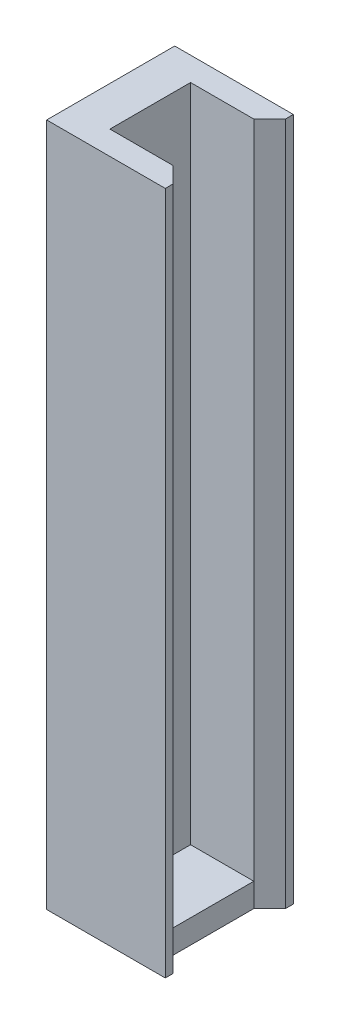
ISO-10303-21;
HEADER;
FILE_DESCRIPTION(('STEP AP214'),'2;1');
FILE_NAME('part.step','',(''),(''),'','','');
FILE_SCHEMA(('AUTOMOTIVE_DESIGN { 1 0 10303 214 1 1 1 1 }'));
ENDSEC;
DATA;
#1=APPLICATION_CONTEXT('core data for automotive mechanical design processes');
#2=APPLICATION_PROTOCOL_DEFINITION('international standard','automotive_design',2000,#1);
#3=PRODUCT_CONTEXT('',#1,'mechanical');
#4=PRODUCT('Part','Part','',(#3));
#5=PRODUCT_RELATED_PRODUCT_CATEGORY('part','',(#4));
#6=PRODUCT_DEFINITION_FORMATION('','',#4);
#7=PRODUCT_DEFINITION_CONTEXT('part definition',#1,'design');
#8=PRODUCT_DEFINITION('design','',#6,#7);
#9=PRODUCT_DEFINITION_SHAPE('','',#8);
#10=(LENGTH_UNIT() NAMED_UNIT(*) SI_UNIT(.MILLI.,.METRE.));
#11=(NAMED_UNIT(*) PLANE_ANGLE_UNIT() SI_UNIT($,.RADIAN.));
#12=(NAMED_UNIT(*) SI_UNIT($,.STERADIAN.) SOLID_ANGLE_UNIT());
#13=UNCERTAINTY_MEASURE_WITH_UNIT(LENGTH_MEASURE(1.E-05),#10,'distance_accuracy_value','');
#14=(GEOMETRIC_REPRESENTATION_CONTEXT(3) GLOBAL_UNCERTAINTY_ASSIGNED_CONTEXT((#13)) GLOBAL_UNIT_ASSIGNED_CONTEXT((#10,
#11,#12)) REPRESENTATION_CONTEXT('',''));
#15=CARTESIAN_POINT('',(0.,0.,0.));
#16=DIRECTION('',(0.,0.,1.));
#17=DIRECTION('',(1.,0.,0.));
#18=AXIS2_PLACEMENT_3D('',#15,#16,#17);
#19=CARTESIAN_POINT('',(-12.5,-26.5,0.));
#20=DIRECTION('',(0.,1.,0.));
#21=DIRECTION('',(0.,0.,1.));
#22=AXIS2_PLACEMENT_3D('',#19,#20,#21);
#23=PLANE('',#22);
#24=DIRECTION('',(0.,0.,-1.));
#25=VECTOR('',#24,1.);
#26=CARTESIAN_POINT('',(2.5,-26.5,8.1));
#27=LINE('',#26,#25);
#28=CARTESIAN_POINT('',(2.5,-26.5,8.1));
#29=VERTEX_POINT('',#28);
#30=CARTESIAN_POINT('',(2.5,-26.5,7.1));
#31=VERTEX_POINT('',#30);
#32=EDGE_CURVE('E172',#29,#31,#27,.T.);
#33=ORIENTED_EDGE('',*,*,#32,.T.);
#34=DIRECTION('',(0.707106781186546,0.,0.707106781186549));
#35=VECTOR('',#34,1.);
#36=CARTESIAN_POINT('',(-8.54999999999998,-26.5,-3.95000000000001));
#37=LINE('',#36,#35);
#38=CARTESIAN_POINT('',(0.500000000000002,-26.5,5.1));
#39=VERTEX_POINT('',#38);
#40=EDGE_CURVE('E12',#31,#39,#37,.F.);
#41=ORIENTED_EDGE('',*,*,#40,.T.);
#42=DIRECTION('',(1.,0.,0.));
#43=VECTOR('',#42,1.);
#44=CARTESIAN_POINT('',(-12.5,-26.5,5.1));
#45=LINE('',#44,#43);
#46=CARTESIAN_POINT('',(-7.5,-26.5,5.1));
#47=VERTEX_POINT('',#46);
#48=EDGE_CURVE('E135',#47,#39,#45,.T.);
#49=ORIENTED_EDGE('',*,*,#48,.F.);
#50=DIRECTION('',(0.,0.,1.));
#51=VECTOR('',#50,1.);
#52=CARTESIAN_POINT('',(-7.5,-26.5,0.));
#53=LINE('',#52,#51);
#54=CARTESIAN_POINT('',(-7.5,-26.5,-5.1));
#55=VERTEX_POINT('',#54);
#56=EDGE_CURVE('E197',#55,#47,#53,.T.);
#57=ORIENTED_EDGE('',*,*,#56,.F.);
#58=DIRECTION('',(1.,0.,0.));
#59=VECTOR('',#58,1.);
#60=CARTESIAN_POINT('',(-12.5,-26.5,-5.1));
#61=LINE('',#60,#59);
#62=CARTESIAN_POINT('',(0.499999999999995,-26.5,-5.1));
#63=VERTEX_POINT('',#62);
#64=EDGE_CURVE('E182',#55,#63,#61,.T.);
#65=ORIENTED_EDGE('',*,*,#64,.T.);
#66=DIRECTION('',(0.707106781186549,0.,-0.707106781186546));
#67=VECTOR('',#66,1.);
#68=CARTESIAN_POINT('',(-8.55000000000003,-26.5,3.94999999999999));
#69=LINE('',#68,#67);
#70=CARTESIAN_POINT('',(2.5,-26.5,-7.09999999999999));
#71=VERTEX_POINT('',#70);
#72=EDGE_CURVE('E48',#63,#71,#69,.T.);
#73=ORIENTED_EDGE('',*,*,#72,.T.);
#74=DIRECTION('',(0.,0.,1.));
#75=VECTOR('',#74,1.);
#76=CARTESIAN_POINT('',(2.5,-26.5,-8.1));
#77=LINE('',#76,#75);
#78=CARTESIAN_POINT('',(2.5,-26.5,-8.1));
#79=VERTEX_POINT('',#78);
#80=EDGE_CURVE('E188',#79,#71,#77,.T.);
#81=ORIENTED_EDGE('',*,*,#80,.F.);
#82=DIRECTION('',(1.,0.,0.));
#83=VECTOR('',#82,1.);
#84=CARTESIAN_POINT('',(-12.5,-26.5,-8.1));
#85=LINE('',#84,#83);
#86=CARTESIAN_POINT('',(-12.5,-26.5,-8.1));
#87=VERTEX_POINT('',#86);
#88=EDGE_CURVE('E185',#87,#79,#85,.T.);
#89=ORIENTED_EDGE('',*,*,#88,.F.);
#90=DIRECTION('',(0.,0.,1.));
#91=VECTOR('',#90,1.);
#92=CARTESIAN_POINT('',(-12.5,-26.5,0.));
#93=LINE('',#92,#91);
#94=CARTESIAN_POINT('',(-12.5,-26.5,8.1));
#95=VERTEX_POINT('',#94);
#96=EDGE_CURVE('E200',#87,#95,#93,.T.);
#97=ORIENTED_EDGE('',*,*,#96,.T.);
#98=DIRECTION('',(1.,0.,0.));
#99=VECTOR('',#98,1.);
#100=CARTESIAN_POINT('',(-12.5,-26.5,8.1));
#101=LINE('',#100,#99);
#102=EDGE_CURVE('E169',#95,#29,#101,.T.);
#103=ORIENTED_EDGE('',*,*,#102,.T.);
#104=EDGE_LOOP('',(#33,#41,#49,#57,#65,#73,#81,#89,#97,#103));
#105=FACE_BOUND('',#104,.T.);
#106=ADVANCED_FACE('F39',(#105),#23,.T.);
#107=CARTESIAN_POINT('',(-12.5,-74.,0.));
#108=DIRECTION('',(1.,0.,0.));
#109=DIRECTION('',(0.,0.,-1.));
#110=AXIS2_PLACEMENT_3D('',#107,#108,#109);
#111=CYLINDRICAL_SURFACE('',#110,1.6);
#112=CARTESIAN_POINT('',(-12.5,-74.,0.));
#113=DIRECTION('',(-1.,0.,0.));
#114=DIRECTION('',(0.,0.,1.));
#115=AXIS2_PLACEMENT_3D('',#112,#113,#114);
#116=CIRCLE('',#115,1.6);
#117=CARTESIAN_POINT('',(-12.5,-74.,1.60000000000008));
#118=VERTEX_POINT('',#117);
#119=EDGE_CURVE('E203',#118,#118,#116,.F.);
#120=ORIENTED_EDGE('',*,*,#119,.F.);
#121=EDGE_LOOP('',(#120));
#122=FACE_BOUND('',#121,.T.);
#123=CARTESIAN_POINT('',(-7.5,-74.,0.));
#124=DIRECTION('',(-1.,0.,0.));
#125=DIRECTION('',(0.,0.,1.));
#126=AXIS2_PLACEMENT_3D('',#123,#124,#125);
#127=CIRCLE('',#126,1.6);
#128=CARTESIAN_POINT('',(-7.5,-74.,1.60000000000008));
#129=VERTEX_POINT('',#128);
#130=EDGE_CURVE('E218',#129,#129,#127,.F.);
#131=ORIENTED_EDGE('',*,*,#130,.T.);
#132=EDGE_LOOP('',(#131));
#133=FACE_BOUND('',#132,.T.);
#134=ADVANCED_FACE('F265',(#122,#133),#111,.F.);
#135=CARTESIAN_POINT('',(-12.5,-34.,0.));
#136=DIRECTION('',(1.,0.,0.));
#137=DIRECTION('',(0.,0.,-1.));
#138=AXIS2_PLACEMENT_3D('',#135,#136,#137);
#139=CYLINDRICAL_SURFACE('',#138,1.6);
#140=CARTESIAN_POINT('',(-12.5,-34.,0.));
#141=DIRECTION('',(-1.,0.,0.));
#142=DIRECTION('',(0.,0.,1.));
#143=AXIS2_PLACEMENT_3D('',#140,#141,#142);
#144=CIRCLE('',#143,1.6);
#145=CARTESIAN_POINT('',(-12.5,-34.,1.60000000000005));
#146=VERTEX_POINT('',#145);
#147=EDGE_CURVE('E207',#146,#146,#144,.F.);
#148=ORIENTED_EDGE('',*,*,#147,.F.);
#149=EDGE_LOOP('',(#148));
#150=FACE_BOUND('',#149,.T.);
#151=CARTESIAN_POINT('',(-7.5,-34.,0.));
#152=DIRECTION('',(-1.,0.,0.));
#153=DIRECTION('',(0.,0.,1.));
#154=AXIS2_PLACEMENT_3D('',#151,#152,#153);
#155=CIRCLE('',#154,1.6);
#156=CARTESIAN_POINT('',(-7.5,-34.,1.60000000000005));
#157=VERTEX_POINT('',#156);
#158=EDGE_CURVE('E204',#157,#157,#155,.F.);
#159=ORIENTED_EDGE('',*,*,#158,.T.);
#160=EDGE_LOOP('',(#159));
#161=FACE_BOUND('',#160,.T.);
#162=ADVANCED_FACE('F270',(#150,#161),#139,.F.);
#163=CARTESIAN_POINT('',(-12.5,0.,0.));
#164=DIRECTION('',(-1.,0.,0.));
#165=DIRECTION('',(0.,0.,1.));
#166=AXIS2_PLACEMENT_3D('',#163,#164,#165);
#167=PLANE('',#166);
#168=ORIENTED_EDGE('',*,*,#96,.F.);
#169=DIRECTION('',(0.,1.,0.));
#170=VECTOR('',#169,1.);
#171=CARTESIAN_POINT('',(-12.5,-110.,-8.1));
#172=LINE('',#171,#170);
#173=CARTESIAN_POINT('',(-12.5,-113.,-8.1));
#174=VERTEX_POINT('',#173);
#175=EDGE_CURVE('E193',#174,#87,#172,.T.);
#176=ORIENTED_EDGE('',*,*,#175,.F.);
#177=DIRECTION('',(0.,0.,-1.));
#178=VECTOR('',#177,1.);
#179=CARTESIAN_POINT('',(-12.5,-113.,0.));
#180=LINE('',#179,#178);
#181=CARTESIAN_POINT('',(-12.5,-113.,8.1));
#182=VERTEX_POINT('',#181);
#183=EDGE_CURVE('E159',#182,#174,#180,.T.);
#184=ORIENTED_EDGE('',*,*,#183,.F.);
#185=DIRECTION('',(0.,1.,0.));
#186=VECTOR('',#185,1.);
#187=CARTESIAN_POINT('',(-12.5,-110.,8.1));
#188=LINE('',#187,#186);
#189=EDGE_CURVE('E178',#182,#95,#188,.T.);
#190=ORIENTED_EDGE('',*,*,#189,.T.);
#191=EDGE_LOOP('',(#168,#176,#184,#190));
#192=FACE_BOUND('',#191,.T.);
#193=ORIENTED_EDGE('',*,*,#119,.T.);
#194=EDGE_LOOP('',(#193));
#195=FACE_BOUND('',#194,.T.);
#196=ORIENTED_EDGE('',*,*,#147,.T.);
#197=EDGE_LOOP('',(#196));
#198=FACE_BOUND('',#197,.T.);
#199=ADVANCED_FACE('F281',(#192,#195,#198),#167,.T.);
#200=CARTESIAN_POINT('',(-7.5,0.,0.));
#201=DIRECTION('',(-1.,0.,0.));
#202=DIRECTION('',(0.,0.,1.));
#203=AXIS2_PLACEMENT_3D('',#200,#201,#202);
#204=PLANE('',#203);
#205=ORIENTED_EDGE('',*,*,#56,.T.);
#206=DIRECTION('',(0.,1.,0.));
#207=VECTOR('',#206,1.);
#208=CARTESIAN_POINT('',(-7.5,0.,5.1));
#209=LINE('',#208,#207);
#210=CARTESIAN_POINT('',(-7.5,-110.,5.1));
#211=VERTEX_POINT('',#210);
#212=EDGE_CURVE('E217',#211,#47,#209,.T.);
#213=ORIENTED_EDGE('',*,*,#212,.F.);
#214=DIRECTION('',(0.,0.,1.));
#215=VECTOR('',#214,1.);
#216=CARTESIAN_POINT('',(-7.5,-110.,0.));
#217=LINE('',#216,#215);
#218=CARTESIAN_POINT('',(-7.5,-110.,-5.1));
#219=VERTEX_POINT('',#218);
#220=EDGE_CURVE('E214',#219,#211,#217,.T.);
#221=ORIENTED_EDGE('',*,*,#220,.F.);
#222=DIRECTION('',(0.,-1.,0.));
#223=VECTOR('',#222,1.);
#224=CARTESIAN_POINT('',(-7.5,0.,-5.1));
#225=LINE('',#224,#223);
#226=EDGE_CURVE('E213',#55,#219,#225,.T.);
#227=ORIENTED_EDGE('',*,*,#226,.F.);
#228=EDGE_LOOP('',(#205,#213,#221,#227));
#229=FACE_BOUND('',#228,.T.);
#230=ORIENTED_EDGE('',*,*,#130,.F.);
#231=EDGE_LOOP('',(#230));
#232=FACE_BOUND('',#231,.T.);
#233=ORIENTED_EDGE('',*,*,#158,.F.);
#234=EDGE_LOOP('',(#233));
#235=FACE_BOUND('',#234,.T.);
#236=ADVANCED_FACE('F255',(#229,#232,#235),#204,.F.);
#237=CARTESIAN_POINT('',(0.,0.,-5.1));
#238=DIRECTION('',(0.,0.,-1.));
#239=DIRECTION('',(-1.,0.,0.));
#240=AXIS2_PLACEMENT_3D('',#237,#238,#239);
#241=PLANE('',#240);
#242=DIRECTION('',(-1.,0.,0.));
#243=VECTOR('',#242,1.);
#244=CARTESIAN_POINT('',(-12.5,-110.,-5.1));
#245=LINE('',#244,#243);
#246=CARTESIAN_POINT('',(0.499999999999995,-110.,-5.1));
#247=VERTEX_POINT('',#246);
#248=EDGE_CURVE('E192',#247,#219,#245,.T.);
#249=ORIENTED_EDGE('',*,*,#248,.F.);
#250=DIRECTION('',(0.,1.,0.));
#251=VECTOR('',#250,1.);
#252=CARTESIAN_POINT('',(0.499999999999996,0.,-5.1));
#253=LINE('',#252,#251);
#254=EDGE_CURVE('E63',#247,#63,#253,.T.);
#255=ORIENTED_EDGE('',*,*,#254,.T.);
#256=ORIENTED_EDGE('',*,*,#64,.F.);
#257=ORIENTED_EDGE('',*,*,#226,.T.);
#258=EDGE_LOOP('',(#249,#255,#256,#257));
#259=FACE_BOUND('',#258,.T.);
#260=ADVANCED_FACE('F257',(#259),#241,.F.);
#261=CARTESIAN_POINT('',(2.5,-110.,-8.1));
#262=DIRECTION('',(-1.,0.,0.));
#263=DIRECTION('',(0.,0.,1.));
#264=AXIS2_PLACEMENT_3D('',#261,#262,#263);
#265=PLANE('',#264);
#266=DIRECTION('',(0.,-1.,0.));
#267=VECTOR('',#266,1.);
#268=CARTESIAN_POINT('',(2.5,-110.,-8.1));
#269=LINE('',#268,#267);
#270=CARTESIAN_POINT('',(2.5,-113.,-8.1));
#271=VERTEX_POINT('',#270);
#272=EDGE_CURVE('E195',#79,#271,#269,.T.);
#273=ORIENTED_EDGE('',*,*,#272,.F.);
#274=ORIENTED_EDGE('',*,*,#80,.T.);
#275=DIRECTION('',(0.,-1.,0.));
#276=VECTOR('',#275,1.);
#277=CARTESIAN_POINT('',(2.5,-110.,-7.09999999999999));
#278=LINE('',#277,#276);
#279=CARTESIAN_POINT('',(2.5,-113.,-7.09999999999999));
#280=VERTEX_POINT('',#279);
#281=EDGE_CURVE('E55',#71,#280,#278,.T.);
#282=ORIENTED_EDGE('',*,*,#281,.T.);
#283=DIRECTION('',(0.,0.,1.));
#284=VECTOR('',#283,1.);
#285=CARTESIAN_POINT('',(2.5,-113.,0.));
#286=LINE('',#285,#284);
#287=EDGE_CURVE('E165',#271,#280,#286,.T.);
#288=ORIENTED_EDGE('',*,*,#287,.F.);
#289=EDGE_LOOP('',(#273,#274,#282,#288));
#290=FACE_BOUND('',#289,.T.);
#291=ADVANCED_FACE('F233',(#290),#265,.F.);
#292=CARTESIAN_POINT('',(0.,0.,-8.1));
#293=DIRECTION('',(0.,0.,-1.));
#294=DIRECTION('',(-1.,0.,0.));
#295=AXIS2_PLACEMENT_3D('',#292,#293,#294);
#296=PLANE('',#295);
#297=ORIENTED_EDGE('',*,*,#175,.T.);
#298=ORIENTED_EDGE('',*,*,#88,.T.);
#299=ORIENTED_EDGE('',*,*,#272,.T.);
#300=DIRECTION('',(1.,0.,0.));
#301=VECTOR('',#300,1.);
#302=CARTESIAN_POINT('',(0.,-113.,-8.1));
#303=LINE('',#302,#301);
#304=EDGE_CURVE('E162',#174,#271,#303,.T.);
#305=ORIENTED_EDGE('',*,*,#304,.F.);
#306=EDGE_LOOP('',(#297,#298,#299,#305));
#307=FACE_BOUND('',#306,.T.);
#308=ADVANCED_FACE('F237',(#307),#296,.T.);
#309=CARTESIAN_POINT('',(0.,0.,5.1));
#310=DIRECTION('',(0.,0.,1.));
#311=DIRECTION('',(-1.,0.,0.));
#312=AXIS2_PLACEMENT_3D('',#309,#310,#311);
#313=PLANE('',#312);
#314=ORIENTED_EDGE('',*,*,#212,.T.);
#315=ORIENTED_EDGE('',*,*,#48,.T.);
#316=DIRECTION('',(0.,-1.,0.));
#317=VECTOR('',#316,1.);
#318=CARTESIAN_POINT('',(0.500000000000003,-110.,5.1));
#319=LINE('',#318,#317);
#320=CARTESIAN_POINT('',(0.500000000000002,-110.,5.1));
#321=VERTEX_POINT('',#320);
#322=EDGE_CURVE('E210',#39,#321,#319,.T.);
#323=ORIENTED_EDGE('',*,*,#322,.T.);
#324=DIRECTION('',(-1.,0.,0.));
#325=VECTOR('',#324,1.);
#326=CARTESIAN_POINT('',(-12.5,-110.,5.1));
#327=LINE('',#326,#325);
#328=EDGE_CURVE('E177',#321,#211,#327,.T.);
#329=ORIENTED_EDGE('',*,*,#328,.T.);
#330=EDGE_LOOP('',(#314,#315,#323,#329));
#331=FACE_BOUND('',#330,.T.);
#332=ADVANCED_FACE('F250',(#331),#313,.F.);
#333=CARTESIAN_POINT('',(2.5,-110.,8.1));
#334=DIRECTION('',(1.,0.,0.));
#335=DIRECTION('',(0.,0.,-1.));
#336=AXIS2_PLACEMENT_3D('',#333,#334,#335);
#337=PLANE('',#336);
#338=DIRECTION('',(0.,-1.,0.));
#339=VECTOR('',#338,1.);
#340=CARTESIAN_POINT('',(2.5,-110.,8.1));
#341=LINE('',#340,#339);
#342=CARTESIAN_POINT('',(2.5,-113.,8.1));
#343=VERTEX_POINT('',#342);
#344=EDGE_CURVE('E180',#29,#343,#341,.T.);
#345=ORIENTED_EDGE('',*,*,#344,.T.);
#346=DIRECTION('',(0.,0.,1.));
#347=VECTOR('',#346,1.);
#348=CARTESIAN_POINT('',(2.5,-113.,0.));
#349=LINE('',#348,#347);
#350=CARTESIAN_POINT('',(2.5,-113.,7.1));
#351=VERTEX_POINT('',#350);
#352=EDGE_CURVE('E146',#351,#343,#349,.T.);
#353=ORIENTED_EDGE('',*,*,#352,.F.);
#354=DIRECTION('',(0.,1.,0.));
#355=VECTOR('',#354,1.);
#356=CARTESIAN_POINT('',(2.5,-105.,7.1));
#357=LINE('',#356,#355);
#358=EDGE_CURVE('E142',#351,#31,#357,.T.);
#359=ORIENTED_EDGE('',*,*,#358,.T.);
#360=ORIENTED_EDGE('',*,*,#32,.F.);
#361=EDGE_LOOP('',(#345,#353,#359,#360));
#362=FACE_BOUND('',#361,.T.);
#363=ADVANCED_FACE('F246',(#362),#337,.T.);
#364=CARTESIAN_POINT('',(0.,0.,8.1));
#365=DIRECTION('',(0.,0.,1.));
#366=DIRECTION('',(-1.,0.,0.));
#367=AXIS2_PLACEMENT_3D('',#364,#365,#366);
#368=PLANE('',#367);
#369=ORIENTED_EDGE('',*,*,#189,.F.);
#370=DIRECTION('',(-1.,0.,0.));
#371=VECTOR('',#370,1.);
#372=CARTESIAN_POINT('',(0.,-113.,8.1));
#373=LINE('',#372,#371);
#374=EDGE_CURVE('E156',#343,#182,#373,.T.);
#375=ORIENTED_EDGE('',*,*,#374,.F.);
#376=ORIENTED_EDGE('',*,*,#344,.F.);
#377=ORIENTED_EDGE('',*,*,#102,.F.);
#378=EDGE_LOOP('',(#369,#375,#376,#377));
#379=FACE_BOUND('',#378,.T.);
#380=ADVANCED_FACE('F242',(#379),#368,.T.);
#381=CARTESIAN_POINT('',(0.500000000000003,0.,5.1));
#382=DIRECTION('',(0.707106781186549,0.,-0.707106781186546));
#383=DIRECTION('',(0.,1.,0.));
#384=AXIS2_PLACEMENT_3D('',#381,#382,#383);
#385=PLANE('',#384);
#386=ORIENTED_EDGE('',*,*,#322,.F.);
#387=ORIENTED_EDGE('',*,*,#40,.F.);
#388=ORIENTED_EDGE('',*,*,#358,.F.);
#389=DIRECTION('',(0.707106781186546,0.,0.707106781186549));
#390=VECTOR('',#389,1.);
#391=CARTESIAN_POINT('',(-2.3,-113.,2.29999999999999));
#392=LINE('',#391,#390);
#393=CARTESIAN_POINT('',(0.500000000000002,-113.,5.1));
#394=VERTEX_POINT('',#393);
#395=EDGE_CURVE('E139',#394,#351,#392,.T.);
#396=ORIENTED_EDGE('',*,*,#395,.F.);
#397=DIRECTION('',(0.,1.,0.));
#398=VECTOR('',#397,1.);
#399=CARTESIAN_POINT('',(0.500000000000002,-113.,5.1));
#400=LINE('',#399,#398);
#401=EDGE_CURVE('E126',#394,#321,#400,.T.);
#402=ORIENTED_EDGE('',*,*,#401,.T.);
#403=EDGE_LOOP('',(#386,#387,#388,#396,#402));
#404=FACE_BOUND('',#403,.T.);
#405=ADVANCED_FACE('F140',(#404),#385,.T.);
#406=CARTESIAN_POINT('',(2.5,-110.,-7.09999999999999));
#407=DIRECTION('',(-0.707106781186546,0.,-0.707106781186549));
#408=DIRECTION('',(0.,-1.,0.));
#409=AXIS2_PLACEMENT_3D('',#406,#407,#408);
#410=PLANE('',#409);
#411=ORIENTED_EDGE('',*,*,#281,.F.);
#412=ORIENTED_EDGE('',*,*,#72,.F.);
#413=ORIENTED_EDGE('',*,*,#254,.F.);
#414=DIRECTION('',(0.,1.,0.));
#415=VECTOR('',#414,1.);
#416=CARTESIAN_POINT('',(0.499999999999995,-113.,-5.1));
#417=LINE('',#416,#415);
#418=CARTESIAN_POINT('',(0.499999999999995,-113.,-5.1));
#419=VERTEX_POINT('',#418);
#420=EDGE_CURVE('E136',#419,#247,#417,.T.);
#421=ORIENTED_EDGE('',*,*,#420,.F.);
#422=DIRECTION('',(-0.707106781186549,0.,0.707106781186546));
#423=VECTOR('',#422,1.);
#424=CARTESIAN_POINT('',(-2.3,-113.,-2.30000000000001));
#425=LINE('',#424,#423);
#426=EDGE_CURVE('E150',#280,#419,#425,.T.);
#427=ORIENTED_EDGE('',*,*,#426,.F.);
#428=EDGE_LOOP('',(#411,#412,#413,#421,#427));
#429=FACE_BOUND('',#428,.T.);
#430=ADVANCED_FACE('F42',(#429),#410,.F.);
#431=CARTESIAN_POINT('',(0.499999999999999,-113.,0.));
#432=DIRECTION('',(1.,0.,0.));
#433=DIRECTION('',(0.,0.,-1.));
#434=AXIS2_PLACEMENT_3D('',#431,#432,#433);
#435=PLANE('',#434);
#436=DIRECTION('',(0.,0.,-1.));
#437=VECTOR('',#436,1.);
#438=CARTESIAN_POINT('',(0.499999999999999,-110.,0.));
#439=LINE('',#438,#437);
#440=EDGE_CURVE('E133',#321,#247,#439,.T.);
#441=ORIENTED_EDGE('',*,*,#440,.F.);
#442=ORIENTED_EDGE('',*,*,#401,.F.);
#443=DIRECTION('',(0.,0.,-1.));
#444=VECTOR('',#443,1.);
#445=CARTESIAN_POINT('',(0.499999999999999,-113.,0.));
#446=LINE('',#445,#444);
#447=EDGE_CURVE('E131',#394,#419,#446,.T.);
#448=ORIENTED_EDGE('',*,*,#447,.T.);
#449=ORIENTED_EDGE('',*,*,#420,.T.);
#450=EDGE_LOOP('',(#441,#442,#448,#449));
#451=FACE_BOUND('',#450,.T.);
#452=ADVANCED_FACE('F128',(#451),#435,.T.);
#453=CARTESIAN_POINT('',(0.,-113.,0.));
#454=DIRECTION('',(0.,-1.,0.));
#455=DIRECTION('',(0.,0.,-1.));
#456=AXIS2_PLACEMENT_3D('',#453,#454,#455);
#457=PLANE('',#456);
#458=ORIENTED_EDGE('',*,*,#447,.F.);
#459=ORIENTED_EDGE('',*,*,#395,.T.);
#460=ORIENTED_EDGE('',*,*,#352,.T.);
#461=ORIENTED_EDGE('',*,*,#374,.T.);
#462=ORIENTED_EDGE('',*,*,#183,.T.);
#463=ORIENTED_EDGE('',*,*,#304,.T.);
#464=ORIENTED_EDGE('',*,*,#287,.T.);
#465=ORIENTED_EDGE('',*,*,#426,.T.);
#466=EDGE_LOOP('',(#458,#459,#460,#461,#462,#463,#464,#465));
#467=FACE_BOUND('',#466,.T.);
#468=ADVANCED_FACE('F148',(#467),#457,.T.);
#469=CARTESIAN_POINT('',(0.,-110.,0.));
#470=DIRECTION('',(0.,-1.,0.));
#471=DIRECTION('',(0.,0.,-1.));
#472=AXIS2_PLACEMENT_3D('',#469,#470,#471);
#473=PLANE('',#472);
#474=ORIENTED_EDGE('',*,*,#328,.F.);
#475=ORIENTED_EDGE('',*,*,#440,.T.);
#476=ORIENTED_EDGE('',*,*,#248,.T.);
#477=ORIENTED_EDGE('',*,*,#220,.T.);
#478=EDGE_LOOP('',(#474,#475,#476,#477));
#479=FACE_BOUND('',#478,.T.);
#480=ADVANCED_FACE('F252',(#479),#473,.F.);
#481=CLOSED_SHELL('',(#106,#134,#162,#199,#236,#260,#291,#308,#332,#363,#380,#405,#430,#452,
#468,#480));
#482=MANIFOLD_SOLID_BREP('B2',#481);
#483=ADVANCED_BREP_SHAPE_REPRESENTATION('',(#18,#482),#14);
#484=SHAPE_DEFINITION_REPRESENTATION(#9,#483);
ENDSEC;
END-ISO-10303-21;
